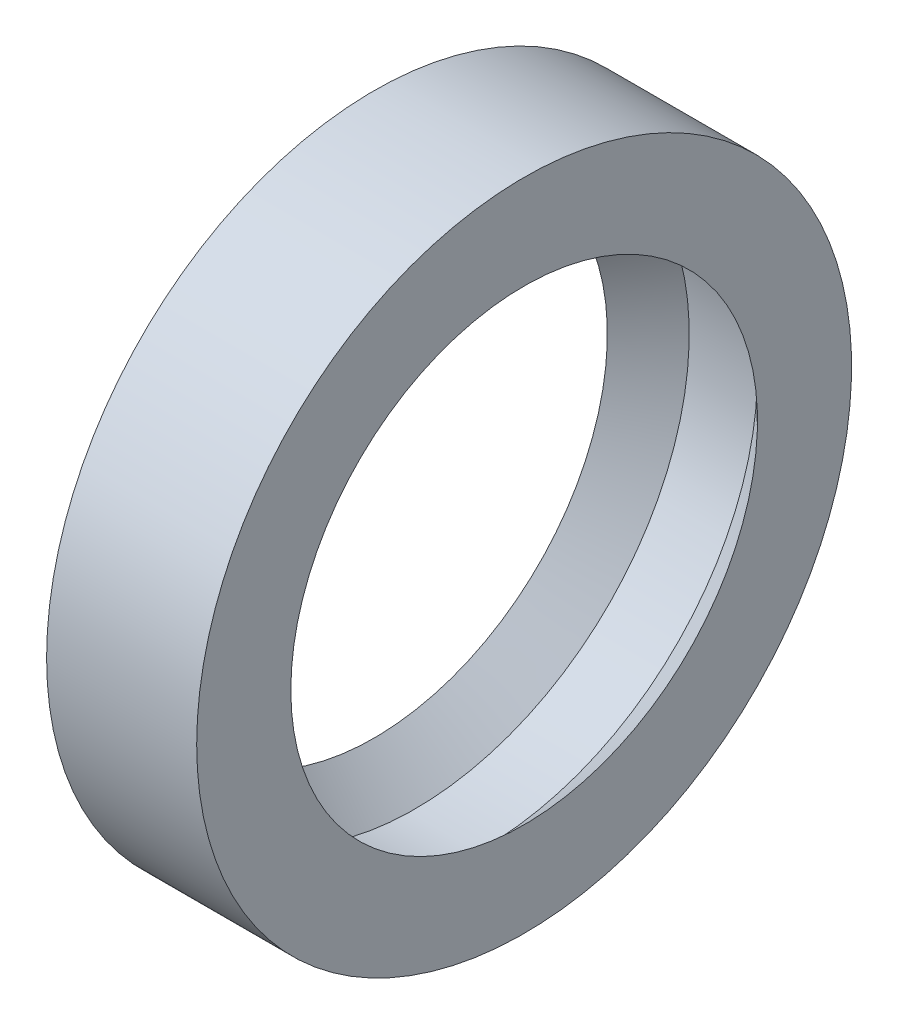
ISO-10303-21;
HEADER;
FILE_DESCRIPTION(('STEP AP214'),'2;1');
FILE_NAME('part.step','',(''),(''),'','','');
FILE_SCHEMA(('AUTOMOTIVE_DESIGN { 1 0 10303 214 1 1 1 1 }'));
ENDSEC;
DATA;
#1=APPLICATION_CONTEXT('core data for automotive mechanical design processes');
#2=APPLICATION_PROTOCOL_DEFINITION('international standard','automotive_design',2000,#1);
#3=PRODUCT_CONTEXT('',#1,'mechanical');
#4=PRODUCT('Part','Part','',(#3));
#5=PRODUCT_RELATED_PRODUCT_CATEGORY('part','',(#4));
#6=PRODUCT_DEFINITION_FORMATION('','',#4);
#7=PRODUCT_DEFINITION_CONTEXT('part definition',#1,'design');
#8=PRODUCT_DEFINITION('design','',#6,#7);
#9=PRODUCT_DEFINITION_SHAPE('','',#8);
#10=(LENGTH_UNIT() NAMED_UNIT(*) SI_UNIT(.MILLI.,.METRE.));
#11=(NAMED_UNIT(*) PLANE_ANGLE_UNIT() SI_UNIT($,.RADIAN.));
#12=(NAMED_UNIT(*) SI_UNIT($,.STERADIAN.) SOLID_ANGLE_UNIT());
#13=UNCERTAINTY_MEASURE_WITH_UNIT(LENGTH_MEASURE(1.E-05),#10,'distance_accuracy_value','');
#14=(GEOMETRIC_REPRESENTATION_CONTEXT(3) GLOBAL_UNCERTAINTY_ASSIGNED_CONTEXT((#13)) GLOBAL_UNIT_ASSIGNED_CONTEXT((#10,
#11,#12)) REPRESENTATION_CONTEXT('',''));
#15=CARTESIAN_POINT('',(0.,0.,0.));
#16=DIRECTION('',(0.,0.,1.));
#17=DIRECTION('',(1.,0.,0.));
#18=AXIS2_PLACEMENT_3D('',#15,#16,#17);
#19=CARTESIAN_POINT('',(-5.,24.,0.));
#20=DIRECTION('',(1.,0.,0.));
#21=DIRECTION('',(0.,0.,-1.));
#22=AXIS2_PLACEMENT_3D('',#19,#20,#21);
#23=PLANE('',#22);
#24=CARTESIAN_POINT('',(-5.,0.,0.));
#25=DIRECTION('',(-1.,0.,0.));
#26=DIRECTION('',(0.,0.,1.));
#27=AXIS2_PLACEMENT_3D('',#24,#25,#26);
#28=CIRCLE('',#27,17.1);
#29=CARTESIAN_POINT('',(-5.,0.,17.1));
#30=VERTEX_POINT('',#29);
#31=EDGE_CURVE('E10',#30,#30,#28,.T.);
#32=ORIENTED_EDGE('',*,*,#31,.F.);
#33=EDGE_LOOP('',(#32));
#34=FACE_BOUND('',#33,.T.);
#35=CARTESIAN_POINT('',(-5.,0.,0.));
#36=DIRECTION('',(-1.,0.,0.));
#37=DIRECTION('',(0.,0.,1.));
#38=AXIS2_PLACEMENT_3D('',#35,#36,#37);
#39=CIRCLE('',#38,24.);
#40=CARTESIAN_POINT('',(-5.,0.,24.));
#41=VERTEX_POINT('',#40);
#42=EDGE_CURVE('E53',#41,#41,#39,.T.);
#43=ORIENTED_EDGE('',*,*,#42,.T.);
#44=EDGE_LOOP('',(#43));
#45=FACE_BOUND('',#44,.T.);
#46=ADVANCED_FACE('F31',(#34,#45),#23,.F.);
#47=CARTESIAN_POINT('',(-5.,0.,0.));
#48=DIRECTION('',(1.,0.,0.));
#49=DIRECTION('',(0.,0.,-1.));
#50=AXIS2_PLACEMENT_3D('',#47,#48,#49);
#51=CONICAL_SURFACE('',#50,17.1,0.785398163397448);
#52=CARTESIAN_POINT('',(-2.,0.,0.));
#53=DIRECTION('',(-1.,0.,0.));
#54=DIRECTION('',(0.,0.,1.));
#55=AXIS2_PLACEMENT_3D('',#52,#53,#54);
#56=CIRCLE('',#55,20.1);
#57=CARTESIAN_POINT('',(-2.,0.,20.1));
#58=VERTEX_POINT('',#57);
#59=EDGE_CURVE('E37',#58,#58,#56,.T.);
#60=ORIENTED_EDGE('',*,*,#59,.F.);
#61=EDGE_LOOP('',(#60));
#62=FACE_BOUND('',#61,.T.);
#63=ORIENTED_EDGE('',*,*,#31,.T.);
#64=EDGE_LOOP('',(#63));
#65=FACE_BOUND('',#64,.T.);
#66=ADVANCED_FACE('F78',(#62,#65),#51,.F.);
#67=CARTESIAN_POINT('',(-110.,0.,0.));
#68=DIRECTION('',(-1.,0.,0.));
#69=DIRECTION('',(0.,0.,1.));
#70=AXIS2_PLACEMENT_3D('',#67,#68,#69);
#71=CYLINDRICAL_SURFACE('',#70,20.1);
#72=CARTESIAN_POINT('',(3.,0.,0.));
#73=DIRECTION('',(-1.,0.,0.));
#74=DIRECTION('',(0.,0.,1.));
#75=AXIS2_PLACEMENT_3D('',#72,#73,#74);
#76=CIRCLE('',#75,20.1);
#77=CARTESIAN_POINT('',(3.,0.,20.1));
#78=VERTEX_POINT('',#77);
#79=EDGE_CURVE('E41',#78,#78,#76,.T.);
#80=ORIENTED_EDGE('',*,*,#79,.F.);
#81=EDGE_LOOP('',(#80));
#82=FACE_BOUND('',#81,.T.);
#83=ORIENTED_EDGE('',*,*,#59,.T.);
#84=EDGE_LOOP('',(#83));
#85=FACE_BOUND('',#84,.T.);
#86=ADVANCED_FACE('F73',(#82,#85),#71,.F.);
#87=CARTESIAN_POINT('',(3.,0.,0.));
#88=DIRECTION('',(-1.,0.,0.));
#89=DIRECTION('',(0.,0.,1.));
#90=AXIS2_PLACEMENT_3D('',#87,#88,#89);
#91=CONICAL_SURFACE('',#90,20.1,0.785398163397448);
#92=CARTESIAN_POINT('',(6.00000000000001,0.,0.));
#93=DIRECTION('',(-1.,0.,0.));
#94=DIRECTION('',(0.,0.,1.));
#95=AXIS2_PLACEMENT_3D('',#92,#93,#94);
#96=CIRCLE('',#95,17.1);
#97=CARTESIAN_POINT('',(6.00000000000001,0.,17.1));
#98=VERTEX_POINT('',#97);
#99=EDGE_CURVE('E45',#98,#98,#96,.T.);
#100=ORIENTED_EDGE('',*,*,#99,.F.);
#101=EDGE_LOOP('',(#100));
#102=FACE_BOUND('',#101,.T.);
#103=ORIENTED_EDGE('',*,*,#79,.T.);
#104=EDGE_LOOP('',(#103));
#105=FACE_BOUND('',#104,.T.);
#106=ADVANCED_FACE('F67',(#102,#105),#91,.F.);
#107=CARTESIAN_POINT('',(6.,17.1,0.));
#108=DIRECTION('',(-1.,0.,0.));
#109=DIRECTION('',(0.,0.,1.));
#110=AXIS2_PLACEMENT_3D('',#107,#108,#109);
#111=PLANE('',#110);
#112=CARTESIAN_POINT('',(6.00000000000001,0.,0.));
#113=DIRECTION('',(-1.,0.,0.));
#114=DIRECTION('',(0.,0.,1.));
#115=AXIS2_PLACEMENT_3D('',#112,#113,#114);
#116=CIRCLE('',#115,24.);
#117=CARTESIAN_POINT('',(6.00000000000001,0.,24.));
#118=VERTEX_POINT('',#117);
#119=EDGE_CURVE('E50',#118,#118,#116,.T.);
#120=ORIENTED_EDGE('',*,*,#119,.F.);
#121=EDGE_LOOP('',(#120));
#122=FACE_BOUND('',#121,.T.);
#123=ORIENTED_EDGE('',*,*,#99,.T.);
#124=EDGE_LOOP('',(#123));
#125=FACE_BOUND('',#124,.T.);
#126=ADVANCED_FACE('F61',(#122,#125),#111,.F.);
#127=CARTESIAN_POINT('',(-110.,0.,0.));
#128=DIRECTION('',(-1.,0.,0.));
#129=DIRECTION('',(0.,0.,1.));
#130=AXIS2_PLACEMENT_3D('',#127,#128,#129);
#131=CYLINDRICAL_SURFACE('',#130,24.);
#132=ORIENTED_EDGE('',*,*,#42,.F.);
#133=EDGE_LOOP('',(#132));
#134=FACE_BOUND('',#133,.T.);
#135=ORIENTED_EDGE('',*,*,#119,.T.);
#136=EDGE_LOOP('',(#135));
#137=FACE_BOUND('',#136,.T.);
#138=ADVANCED_FACE('F58',(#134,#137),#131,.T.);
#139=CLOSED_SHELL('',(#46,#66,#86,#106,#126,#138));
#140=MANIFOLD_SOLID_BREP('B2',#139);
#141=ADVANCED_BREP_SHAPE_REPRESENTATION('',(#18,#140),#14);
#142=SHAPE_DEFINITION_REPRESENTATION(#9,#141);
ENDSEC;
END-ISO-10303-21;
